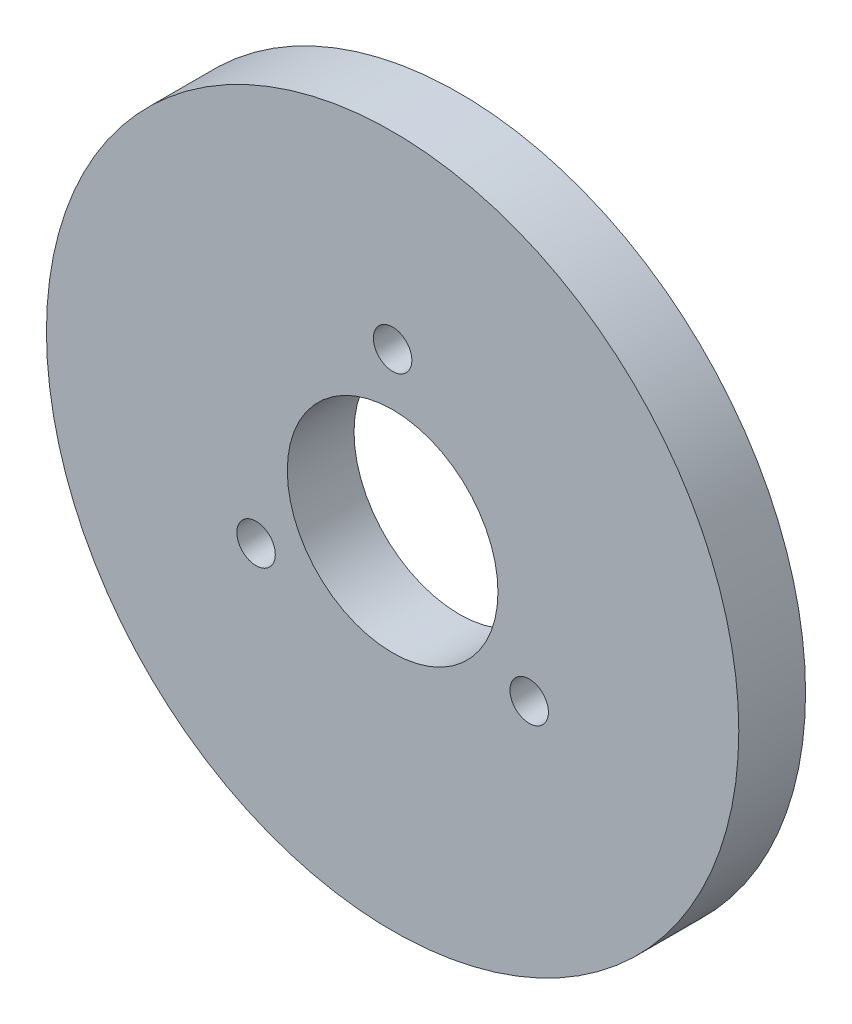
ISO-10303-21;
HEADER;
FILE_DESCRIPTION(('STEP AP214'),'2;1');
FILE_NAME('part.step','',(''),(''),'','','');
FILE_SCHEMA(('AUTOMOTIVE_DESIGN { 1 0 10303 214 1 1 1 1 }'));
ENDSEC;
DATA;
#1=APPLICATION_CONTEXT('core data for automotive mechanical design processes');
#2=APPLICATION_PROTOCOL_DEFINITION('international standard','automotive_design',2000,#1);
#3=PRODUCT_CONTEXT('',#1,'mechanical');
#4=PRODUCT('Part','Part','',(#3));
#5=PRODUCT_RELATED_PRODUCT_CATEGORY('part','',(#4));
#6=PRODUCT_DEFINITION_FORMATION('','',#4);
#7=PRODUCT_DEFINITION_CONTEXT('part definition',#1,'design');
#8=PRODUCT_DEFINITION('design','',#6,#7);
#9=PRODUCT_DEFINITION_SHAPE('','',#8);
#10=(LENGTH_UNIT() NAMED_UNIT(*) SI_UNIT(.MILLI.,.METRE.));
#11=(NAMED_UNIT(*) PLANE_ANGLE_UNIT() SI_UNIT($,.RADIAN.));
#12=(NAMED_UNIT(*) SI_UNIT($,.STERADIAN.) SOLID_ANGLE_UNIT());
#13=UNCERTAINTY_MEASURE_WITH_UNIT(LENGTH_MEASURE(1.E-05),#10,'distance_accuracy_value','');
#14=(GEOMETRIC_REPRESENTATION_CONTEXT(3) GLOBAL_UNCERTAINTY_ASSIGNED_CONTEXT((#13)) GLOBAL_UNIT_ASSIGNED_CONTEXT((#10,
#11,#12)) REPRESENTATION_CONTEXT('',''));
#15=CARTESIAN_POINT('',(0.,0.,0.));
#16=DIRECTION('',(0.,0.,1.));
#17=DIRECTION('',(1.,0.,0.));
#18=AXIS2_PLACEMENT_3D('',#15,#16,#17);
#19=CARTESIAN_POINT('',(0.,0.,6.35));
#20=DIRECTION('',(0.,0.,1.));
#21=DIRECTION('',(1.,0.,0.));
#22=AXIS2_PLACEMENT_3D('',#19,#20,#21);
#23=PLANE('',#22);
#24=CARTESIAN_POINT('',(12.9903810567675,-7.49999999999944,6.35));
#25=DIRECTION('',(0.,0.,1.));
#26=DIRECTION('',(1.,0.,0.));
#27=AXIS2_PLACEMENT_3D('',#24,#25,#26);
#28=CIRCLE('',#27,1.8288);
#29=CARTESIAN_POINT('',(14.8191810567675,-7.49999999999944,6.35));
#30=VERTEX_POINT('',#29);
#31=EDGE_CURVE('E53',#30,#30,#28,.T.);
#32=ORIENTED_EDGE('',*,*,#31,.F.);
#33=EDGE_LOOP('',(#32));
#34=FACE_BOUND('',#33,.T.);
#35=CARTESIAN_POINT('',(0.,0.,6.35));
#36=DIRECTION('',(0.,0.,1.));
#37=DIRECTION('',(1.,0.,0.));
#38=AXIS2_PLACEMENT_3D('',#35,#36,#37);
#39=CIRCLE('',#38,10.0203);
#40=CARTESIAN_POINT('',(10.0203,0.,6.35));
#41=VERTEX_POINT('',#40);
#42=EDGE_CURVE('E42',#41,#41,#39,.T.);
#43=ORIENTED_EDGE('',*,*,#42,.F.);
#44=EDGE_LOOP('',(#43));
#45=FACE_BOUND('',#44,.T.);
#46=CARTESIAN_POINT('',(0.,0.,6.35));
#47=DIRECTION('',(0.,0.,1.));
#48=DIRECTION('',(1.,0.,0.));
#49=AXIS2_PLACEMENT_3D('',#46,#47,#48);
#50=CIRCLE('',#49,32.9311);
#51=CARTESIAN_POINT('',(32.9311,0.,6.35));
#52=VERTEX_POINT('',#51);
#53=EDGE_CURVE('E10',#52,#52,#50,.T.);
#54=ORIENTED_EDGE('',*,*,#53,.T.);
#55=EDGE_LOOP('',(#54));
#56=FACE_BOUND('',#55,.T.);
#57=CARTESIAN_POINT('',(0.,15.,6.35));
#58=DIRECTION('',(0.,0.,1.));
#59=DIRECTION('',(1.,0.,0.));
#60=AXIS2_PLACEMENT_3D('',#57,#58,#59);
#61=CIRCLE('',#60,1.8288);
#62=CARTESIAN_POINT('',(1.8288,15.,6.35));
#63=VERTEX_POINT('',#62);
#64=EDGE_CURVE('E47',#63,#63,#61,.T.);
#65=ORIENTED_EDGE('',*,*,#64,.F.);
#66=EDGE_LOOP('',(#65));
#67=FACE_BOUND('',#66,.T.);
#68=CARTESIAN_POINT('',(-12.9903810567656,-7.50000000000056,6.35));
#69=DIRECTION('',(0.,0.,1.));
#70=DIRECTION('',(1.,0.,0.));
#71=AXIS2_PLACEMENT_3D('',#68,#69,#70);
#72=CIRCLE('',#71,1.8288);
#73=CARTESIAN_POINT('',(-11.1615810567656,-7.50000000000056,6.35));
#74=VERTEX_POINT('',#73);
#75=EDGE_CURVE('E59',#74,#74,#72,.T.);
#76=ORIENTED_EDGE('',*,*,#75,.F.);
#77=EDGE_LOOP('',(#76));
#78=FACE_BOUND('',#77,.T.);
#79=ADVANCED_FACE('F31',(#34,#45,#56,#67,#78),#23,.T.);
#80=CARTESIAN_POINT('',(0.,0.,0.));
#81=DIRECTION('',(0.,0.,1.));
#82=DIRECTION('',(1.,0.,0.));
#83=AXIS2_PLACEMENT_3D('',#80,#81,#82);
#84=PLANE('',#83);
#85=CARTESIAN_POINT('',(12.9903810567675,-7.49999999999944,0.));
#86=DIRECTION('',(0.,0.,1.));
#87=DIRECTION('',(1.,0.,0.));
#88=AXIS2_PLACEMENT_3D('',#85,#86,#87);
#89=CIRCLE('',#88,1.8288);
#90=CARTESIAN_POINT('',(14.8191810567675,-7.49999999999944,0.));
#91=VERTEX_POINT('',#90);
#92=EDGE_CURVE('E56',#91,#91,#89,.T.);
#93=ORIENTED_EDGE('',*,*,#92,.T.);
#94=EDGE_LOOP('',(#93));
#95=FACE_BOUND('',#94,.T.);
#96=CARTESIAN_POINT('',(0.,0.,0.));
#97=DIRECTION('',(0.,0.,1.));
#98=DIRECTION('',(1.,0.,0.));
#99=AXIS2_PLACEMENT_3D('',#96,#97,#98);
#100=CIRCLE('',#99,10.0203);
#101=CARTESIAN_POINT('',(10.0203,0.,0.));
#102=VERTEX_POINT('',#101);
#103=EDGE_CURVE('E44',#102,#102,#100,.T.);
#104=ORIENTED_EDGE('',*,*,#103,.T.);
#105=EDGE_LOOP('',(#104));
#106=FACE_BOUND('',#105,.T.);
#107=CARTESIAN_POINT('',(0.,0.,0.));
#108=DIRECTION('',(0.,0.,1.));
#109=DIRECTION('',(1.,0.,0.));
#110=AXIS2_PLACEMENT_3D('',#107,#108,#109);
#111=CIRCLE('',#110,32.9311);
#112=CARTESIAN_POINT('',(32.9311,0.,0.));
#113=VERTEX_POINT('',#112);
#114=EDGE_CURVE('E35',#113,#113,#111,.T.);
#115=ORIENTED_EDGE('',*,*,#114,.F.);
#116=EDGE_LOOP('',(#115));
#117=FACE_BOUND('',#116,.T.);
#118=CARTESIAN_POINT('',(0.,15.,0.));
#119=DIRECTION('',(0.,0.,1.));
#120=DIRECTION('',(1.,0.,0.));
#121=AXIS2_PLACEMENT_3D('',#118,#119,#120);
#122=CIRCLE('',#121,1.8288);
#123=CARTESIAN_POINT('',(1.8288,15.,0.));
#124=VERTEX_POINT('',#123);
#125=EDGE_CURVE('E50',#124,#124,#122,.T.);
#126=ORIENTED_EDGE('',*,*,#125,.T.);
#127=EDGE_LOOP('',(#126));
#128=FACE_BOUND('',#127,.T.);
#129=CARTESIAN_POINT('',(-12.9903810567656,-7.50000000000056,0.));
#130=DIRECTION('',(0.,0.,1.));
#131=DIRECTION('',(1.,0.,0.));
#132=AXIS2_PLACEMENT_3D('',#129,#130,#131);
#133=CIRCLE('',#132,1.8288);
#134=CARTESIAN_POINT('',(-11.1615810567656,-7.50000000000056,0.));
#135=VERTEX_POINT('',#134);
#136=EDGE_CURVE('E62',#135,#135,#133,.T.);
#137=ORIENTED_EDGE('',*,*,#136,.T.);
#138=EDGE_LOOP('',(#137));
#139=FACE_BOUND('',#138,.T.);
#140=ADVANCED_FACE('F72',(#95,#106,#117,#128,#139),#84,.F.);
#141=CARTESIAN_POINT('',(0.,0.,6.35));
#142=DIRECTION('',(0.,0.,-1.));
#143=DIRECTION('',(-1.,0.,0.));
#144=AXIS2_PLACEMENT_3D('',#141,#142,#143);
#145=CYLINDRICAL_SURFACE('',#144,32.9311);
#146=ORIENTED_EDGE('',*,*,#53,.F.);
#147=EDGE_LOOP('',(#146));
#148=FACE_BOUND('',#147,.T.);
#149=ORIENTED_EDGE('',*,*,#114,.T.);
#150=EDGE_LOOP('',(#149));
#151=FACE_BOUND('',#150,.T.);
#152=ADVANCED_FACE('F33',(#148,#151),#145,.T.);
#153=CARTESIAN_POINT('',(0.,0.,6.35));
#154=DIRECTION('',(0.,0.,-1.));
#155=DIRECTION('',(-1.,0.,0.));
#156=AXIS2_PLACEMENT_3D('',#153,#154,#155);
#157=CYLINDRICAL_SURFACE('',#156,10.0203);
#158=ORIENTED_EDGE('',*,*,#42,.T.);
#159=EDGE_LOOP('',(#158));
#160=FACE_BOUND('',#159,.T.);
#161=ORIENTED_EDGE('',*,*,#103,.F.);
#162=EDGE_LOOP('',(#161));
#163=FACE_BOUND('',#162,.T.);
#164=ADVANCED_FACE('F82',(#160,#163),#157,.F.);
#165=CARTESIAN_POINT('',(0.,15.,6.35));
#166=DIRECTION('',(0.,0.,-1.));
#167=DIRECTION('',(-1.,0.,0.));
#168=AXIS2_PLACEMENT_3D('',#165,#166,#167);
#169=CYLINDRICAL_SURFACE('',#168,1.8288);
#170=ORIENTED_EDGE('',*,*,#64,.T.);
#171=EDGE_LOOP('',(#170));
#172=FACE_BOUND('',#171,.T.);
#173=ORIENTED_EDGE('',*,*,#125,.F.);
#174=EDGE_LOOP('',(#173));
#175=FACE_BOUND('',#174,.T.);
#176=ADVANCED_FACE('F85',(#172,#175),#169,.F.);
#177=CARTESIAN_POINT('',(12.9903810567675,-7.49999999999944,6.35));
#178=DIRECTION('',(0.,0.,-1.));
#179=DIRECTION('',(-1.,0.,0.));
#180=AXIS2_PLACEMENT_3D('',#177,#178,#179);
#181=CYLINDRICAL_SURFACE('',#180,1.8288);
#182=ORIENTED_EDGE('',*,*,#31,.T.);
#183=EDGE_LOOP('',(#182));
#184=FACE_BOUND('',#183,.T.);
#185=ORIENTED_EDGE('',*,*,#92,.F.);
#186=EDGE_LOOP('',(#185));
#187=FACE_BOUND('',#186,.T.);
#188=ADVANCED_FACE('F89',(#184,#187),#181,.F.);
#189=CARTESIAN_POINT('',(-12.9903810567656,-7.50000000000056,6.35));
#190=DIRECTION('',(0.,0.,-1.));
#191=DIRECTION('',(-1.,0.,0.));
#192=AXIS2_PLACEMENT_3D('',#189,#190,#191);
#193=CYLINDRICAL_SURFACE('',#192,1.8288);
#194=ORIENTED_EDGE('',*,*,#75,.T.);
#195=EDGE_LOOP('',(#194));
#196=FACE_BOUND('',#195,.T.);
#197=ORIENTED_EDGE('',*,*,#136,.F.);
#198=EDGE_LOOP('',(#197));
#199=FACE_BOUND('',#198,.T.);
#200=ADVANCED_FACE('F68',(#196,#199),#193,.F.);
#201=CLOSED_SHELL('',(#79,#140,#152,#164,#176,#188,#200));
#202=MANIFOLD_SOLID_BREP('B2',#201);
#203=ADVANCED_BREP_SHAPE_REPRESENTATION('',(#18,#202),#14);
#204=SHAPE_DEFINITION_REPRESENTATION(#9,#203);
ENDSEC;
END-ISO-10303-21;
